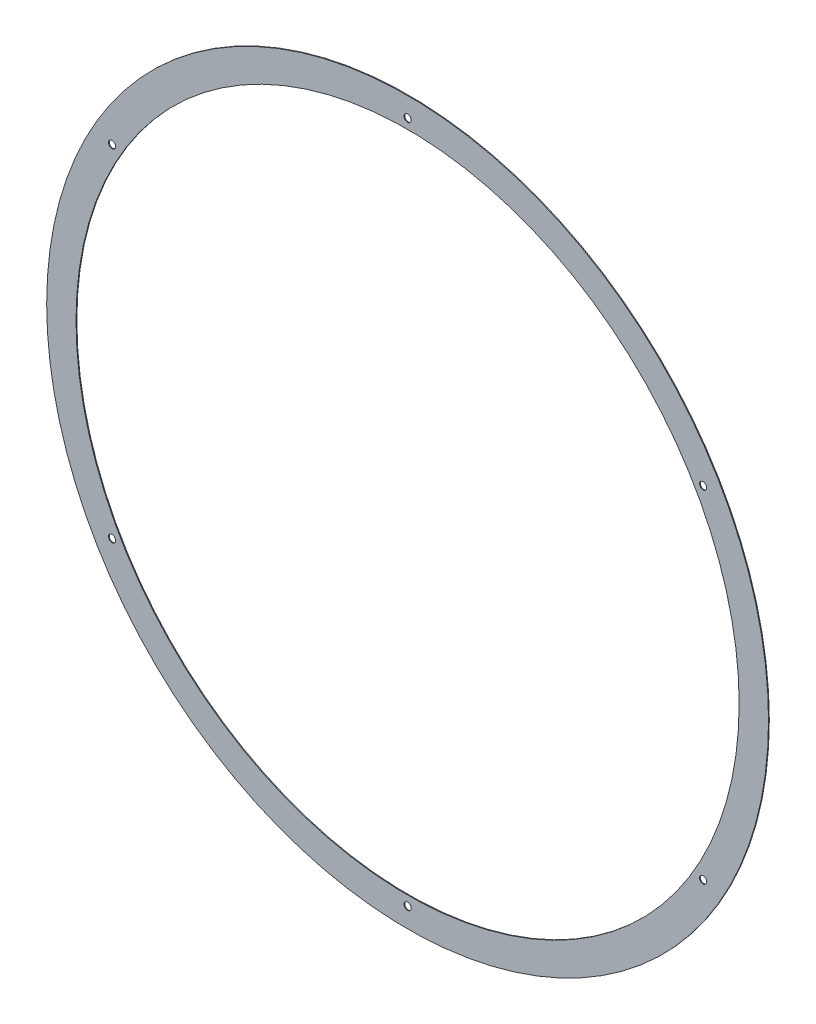
ISO-10303-21;
HEADER;
FILE_DESCRIPTION(('STEP AP214'),'2;1');
FILE_NAME('part.step','',(''),(''),'','','');
FILE_SCHEMA(('AUTOMOTIVE_DESIGN { 1 0 10303 214 1 1 1 1 }'));
ENDSEC;
DATA;
#1=APPLICATION_CONTEXT('core data for automotive mechanical design processes');
#2=APPLICATION_PROTOCOL_DEFINITION('international standard','automotive_design',2000,#1);
#3=PRODUCT_CONTEXT('',#1,'mechanical');
#4=PRODUCT('Part','Part','',(#3));
#5=PRODUCT_RELATED_PRODUCT_CATEGORY('part','',(#4));
#6=PRODUCT_DEFINITION_FORMATION('','',#4);
#7=PRODUCT_DEFINITION_CONTEXT('part definition',#1,'design');
#8=PRODUCT_DEFINITION('design','',#6,#7);
#9=PRODUCT_DEFINITION_SHAPE('','',#8);
#10=(LENGTH_UNIT() NAMED_UNIT(*) SI_UNIT(.MILLI.,.METRE.));
#11=(NAMED_UNIT(*) PLANE_ANGLE_UNIT() SI_UNIT($,.RADIAN.));
#12=(NAMED_UNIT(*) SI_UNIT($,.STERADIAN.) SOLID_ANGLE_UNIT());
#13=UNCERTAINTY_MEASURE_WITH_UNIT(LENGTH_MEASURE(1.E-05),#10,'distance_accuracy_value','');
#14=(GEOMETRIC_REPRESENTATION_CONTEXT(3) GLOBAL_UNCERTAINTY_ASSIGNED_CONTEXT((#13)) GLOBAL_UNIT_ASSIGNED_CONTEXT((#10,
#11,#12)) REPRESENTATION_CONTEXT('',''));
#15=CARTESIAN_POINT('',(0.,0.,0.));
#16=DIRECTION('',(0.,0.,1.));
#17=DIRECTION('',(1.,0.,0.));
#18=AXIS2_PLACEMENT_3D('',#15,#16,#17);
#19=CARTESIAN_POINT('',(-113.658579373613,45.928101341332,0.254));
#20=DIRECTION('',(0.,0.,-1.));
#21=DIRECTION('',(-1.,0.,0.));
#22=AXIS2_PLACEMENT_3D('',#19,#20,#21);
#23=CYLINDRICAL_SURFACE('',#22,1.1303);
#24=CARTESIAN_POINT('',(-113.658579373613,45.928101341332,0.254));
#25=DIRECTION('',(0.,0.,1.));
#26=DIRECTION('',(1.,0.,0.));
#27=AXIS2_PLACEMENT_3D('',#24,#25,#26);
#28=CIRCLE('',#27,1.1303);
#29=CARTESIAN_POINT('',(-112.528279373613,45.928101341332,0.254));
#30=VERTEX_POINT('',#29);
#31=EDGE_CURVE('E40',#30,#30,#28,.T.);
#32=ORIENTED_EDGE('',*,*,#31,.T.);
#33=EDGE_LOOP('',(#32));
#34=FACE_BOUND('',#33,.T.);
#35=CARTESIAN_POINT('',(-113.658579373613,45.928101341332,0.));
#36=DIRECTION('',(0.,0.,1.));
#37=DIRECTION('',(1.,0.,0.));
#38=AXIS2_PLACEMENT_3D('',#35,#36,#37);
#39=CIRCLE('',#38,1.1303);
#40=CARTESIAN_POINT('',(-112.528279373613,45.928101341332,0.));
#41=VERTEX_POINT('',#40);
#42=EDGE_CURVE('E66',#41,#41,#39,.T.);
#43=ORIENTED_EDGE('',*,*,#42,.F.);
#44=EDGE_LOOP('',(#43));
#45=FACE_BOUND('',#44,.T.);
#46=ADVANCED_FACE('F32',(#34,#45),#23,.F.);
#47=CARTESIAN_POINT('',(-20.0737091771575,-8.10314865866907,0.254));
#48=DIRECTION('',(0.,0.,-1.));
#49=DIRECTION('',(-1.,0.,0.));
#50=AXIS2_PLACEMENT_3D('',#47,#48,#49);
#51=CYLINDRICAL_SURFACE('',#50,105.);
#52=CARTESIAN_POINT('',(-20.0737091771575,-8.10314865866907,0.254));
#53=DIRECTION('',(0.,0.,1.));
#54=DIRECTION('',(1.,0.,0.));
#55=AXIS2_PLACEMENT_3D('',#52,#53,#54);
#56=CIRCLE('',#55,105.);
#57=CARTESIAN_POINT('',(84.9262908228426,-8.10314865866907,0.254));
#58=VERTEX_POINT('',#57);
#59=EDGE_CURVE('E45',#58,#58,#56,.T.);
#60=ORIENTED_EDGE('',*,*,#59,.T.);
#61=EDGE_LOOP('',(#60));
#62=FACE_BOUND('',#61,.T.);
#63=CARTESIAN_POINT('',(-20.0737091771575,-8.10314865866907,0.));
#64=DIRECTION('',(0.,0.,1.));
#65=DIRECTION('',(1.,0.,0.));
#66=AXIS2_PLACEMENT_3D('',#63,#64,#65);
#67=CIRCLE('',#66,105.);
#68=CARTESIAN_POINT('',(84.9262908228426,-8.10314865866907,0.));
#69=VERTEX_POINT('',#68);
#70=EDGE_CURVE('E64',#69,#69,#67,.T.);
#71=ORIENTED_EDGE('',*,*,#70,.F.);
#72=EDGE_LOOP('',(#71));
#73=FACE_BOUND('',#72,.T.);
#74=ADVANCED_FACE('F93',(#62,#73),#51,.F.);
#75=CARTESIAN_POINT('',(-20.0737091771575,99.9593513413309,0.254));
#76=DIRECTION('',(0.,0.,-1.));
#77=DIRECTION('',(-1.,0.,0.));
#78=AXIS2_PLACEMENT_3D('',#75,#76,#77);
#79=CYLINDRICAL_SURFACE('',#78,1.1303);
#80=CARTESIAN_POINT('',(-20.0737091771575,99.9593513413309,0.254));
#81=DIRECTION('',(0.,0.,1.));
#82=DIRECTION('',(1.,0.,0.));
#83=AXIS2_PLACEMENT_3D('',#80,#81,#82);
#84=CIRCLE('',#83,1.1303);
#85=CARTESIAN_POINT('',(-18.9434091771574,99.9593513413309,0.254));
#86=VERTEX_POINT('',#85);
#87=EDGE_CURVE('E88',#86,#86,#84,.T.);
#88=ORIENTED_EDGE('',*,*,#87,.T.);
#89=EDGE_LOOP('',(#88));
#90=FACE_BOUND('',#89,.T.);
#91=CARTESIAN_POINT('',(-20.0737091771575,99.9593513413309,0.));
#92=DIRECTION('',(0.,0.,1.));
#93=DIRECTION('',(1.,0.,0.));
#94=AXIS2_PLACEMENT_3D('',#91,#92,#93);
#95=CIRCLE('',#94,1.1303);
#96=CARTESIAN_POINT('',(-18.9434091771574,99.9593513413309,0.));
#97=VERTEX_POINT('',#96);
#98=EDGE_CURVE('E61',#97,#97,#95,.T.);
#99=ORIENTED_EDGE('',*,*,#98,.F.);
#100=EDGE_LOOP('',(#99));
#101=FACE_BOUND('',#100,.T.);
#102=ADVANCED_FACE('F111',(#90,#101),#79,.F.);
#103=CARTESIAN_POINT('',(73.5111610192986,45.9281013413307,0.254));
#104=DIRECTION('',(0.,0.,-1.));
#105=DIRECTION('',(-1.,0.,0.));
#106=AXIS2_PLACEMENT_3D('',#103,#104,#105);
#107=CYLINDRICAL_SURFACE('',#106,1.1303);
#108=CARTESIAN_POINT('',(73.5111610192986,45.9281013413307,0.254));
#109=DIRECTION('',(0.,0.,1.));
#110=DIRECTION('',(1.,0.,0.));
#111=AXIS2_PLACEMENT_3D('',#108,#109,#110);
#112=CIRCLE('',#111,1.1303);
#113=CARTESIAN_POINT('',(74.6414610192986,45.9281013413307,0.254));
#114=VERTEX_POINT('',#113);
#115=EDGE_CURVE('E85',#114,#114,#112,.T.);
#116=ORIENTED_EDGE('',*,*,#115,.T.);
#117=EDGE_LOOP('',(#116));
#118=FACE_BOUND('',#117,.T.);
#119=CARTESIAN_POINT('',(73.5111610192986,45.9281013413307,0.));
#120=DIRECTION('',(0.,0.,1.));
#121=DIRECTION('',(1.,0.,0.));
#122=AXIS2_PLACEMENT_3D('',#119,#120,#121);
#123=CIRCLE('',#122,1.1303);
#124=CARTESIAN_POINT('',(74.6414610192986,45.9281013413307,0.));
#125=VERTEX_POINT('',#124);
#126=EDGE_CURVE('E58',#125,#125,#123,.T.);
#127=ORIENTED_EDGE('',*,*,#126,.F.);
#128=EDGE_LOOP('',(#127));
#129=FACE_BOUND('',#128,.T.);
#130=ADVANCED_FACE('F118',(#118,#129),#107,.F.);
#131=CARTESIAN_POINT('',(73.5111610192982,-62.1343986586695,0.254));
#132=DIRECTION('',(0.,0.,-1.));
#133=DIRECTION('',(-1.,0.,0.));
#134=AXIS2_PLACEMENT_3D('',#131,#132,#133);
#135=CYLINDRICAL_SURFACE('',#134,1.1303);
#136=CARTESIAN_POINT('',(73.5111610192982,-62.1343986586695,0.254));
#137=DIRECTION('',(0.,0.,1.));
#138=DIRECTION('',(1.,0.,0.));
#139=AXIS2_PLACEMENT_3D('',#136,#137,#138);
#140=CIRCLE('',#139,1.1303);
#141=CARTESIAN_POINT('',(74.6414610192982,-62.1343986586695,0.254));
#142=VERTEX_POINT('',#141);
#143=EDGE_CURVE('E80',#142,#142,#140,.T.);
#144=ORIENTED_EDGE('',*,*,#143,.T.);
#145=EDGE_LOOP('',(#144));
#146=FACE_BOUND('',#145,.T.);
#147=CARTESIAN_POINT('',(73.5111610192982,-62.1343986586695,0.));
#148=DIRECTION('',(0.,0.,1.));
#149=DIRECTION('',(1.,0.,0.));
#150=AXIS2_PLACEMENT_3D('',#147,#148,#149);
#151=CIRCLE('',#150,1.1303);
#152=CARTESIAN_POINT('',(74.6414610192982,-62.1343986586695,0.));
#153=VERTEX_POINT('',#152);
#154=EDGE_CURVE('E55',#153,#153,#151,.T.);
#155=ORIENTED_EDGE('',*,*,#154,.F.);
#156=EDGE_LOOP('',(#155));
#157=FACE_BOUND('',#156,.T.);
#158=ADVANCED_FACE('F122',(#146,#157),#135,.F.);
#159=CARTESIAN_POINT('',(-20.0737091771582,-116.165648658669,0.254));
#160=DIRECTION('',(0.,0.,-1.));
#161=DIRECTION('',(-1.,0.,0.));
#162=AXIS2_PLACEMENT_3D('',#159,#160,#161);
#163=CYLINDRICAL_SURFACE('',#162,1.1303);
#164=CARTESIAN_POINT('',(-20.0737091771582,-116.165648658669,0.254));
#165=DIRECTION('',(0.,0.,1.));
#166=DIRECTION('',(1.,0.,0.));
#167=AXIS2_PLACEMENT_3D('',#164,#165,#166);
#168=CIRCLE('',#167,1.1303);
#169=CARTESIAN_POINT('',(-18.9434091771582,-116.165648658669,0.254));
#170=VERTEX_POINT('',#169);
#171=EDGE_CURVE('E75',#170,#170,#168,.T.);
#172=ORIENTED_EDGE('',*,*,#171,.T.);
#173=EDGE_LOOP('',(#172));
#174=FACE_BOUND('',#173,.T.);
#175=CARTESIAN_POINT('',(-20.0737091771582,-116.165648658669,0.));
#176=DIRECTION('',(0.,0.,1.));
#177=DIRECTION('',(1.,0.,0.));
#178=AXIS2_PLACEMENT_3D('',#175,#176,#177);
#179=CIRCLE('',#178,1.1303);
#180=CARTESIAN_POINT('',(-18.9434091771582,-116.165648658669,0.));
#181=VERTEX_POINT('',#180);
#182=EDGE_CURVE('E52',#181,#181,#179,.T.);
#183=ORIENTED_EDGE('',*,*,#182,.F.);
#184=EDGE_LOOP('',(#183));
#185=FACE_BOUND('',#184,.T.);
#186=ADVANCED_FACE('F125',(#174,#185),#163,.F.);
#187=CARTESIAN_POINT('',(-113.658579373614,-62.1343986586682,0.254));
#188=DIRECTION('',(0.,0.,-1.));
#189=DIRECTION('',(-1.,0.,0.));
#190=AXIS2_PLACEMENT_3D('',#187,#188,#189);
#191=CYLINDRICAL_SURFACE('',#190,1.1303);
#192=CARTESIAN_POINT('',(-113.658579373614,-62.1343986586682,0.254));
#193=DIRECTION('',(0.,0.,1.));
#194=DIRECTION('',(1.,0.,0.));
#195=AXIS2_PLACEMENT_3D('',#192,#193,#194);
#196=CIRCLE('',#195,1.1303);
#197=CARTESIAN_POINT('',(-112.528279373614,-62.1343986586682,0.254));
#198=VERTEX_POINT('',#197);
#199=EDGE_CURVE('E71',#198,#198,#196,.T.);
#200=ORIENTED_EDGE('',*,*,#199,.T.);
#201=EDGE_LOOP('',(#200));
#202=FACE_BOUND('',#201,.T.);
#203=CARTESIAN_POINT('',(-113.658579373614,-62.1343986586682,0.));
#204=DIRECTION('',(0.,0.,1.));
#205=DIRECTION('',(1.,0.,0.));
#206=AXIS2_PLACEMENT_3D('',#203,#204,#205);
#207=CIRCLE('',#206,1.1303);
#208=CARTESIAN_POINT('',(-112.528279373614,-62.1343986586682,0.));
#209=VERTEX_POINT('',#208);
#210=EDGE_CURVE('E49',#209,#209,#207,.T.);
#211=ORIENTED_EDGE('',*,*,#210,.F.);
#212=EDGE_LOOP('',(#211));
#213=FACE_BOUND('',#212,.T.);
#214=ADVANCED_FACE('F34',(#202,#213),#191,.F.);
#215=CARTESIAN_POINT('',(-20.0737091771575,-8.10314865866907,0.254));
#216=DIRECTION('',(0.,0.,-1.));
#217=DIRECTION('',(-1.,0.,0.));
#218=AXIS2_PLACEMENT_3D('',#215,#216,#217);
#219=CYLINDRICAL_SURFACE('',#218,114.3);
#220=CARTESIAN_POINT('',(-20.0737091771575,-8.10314865866907,0.254));
#221=DIRECTION('',(0.,0.,1.));
#222=DIRECTION('',(1.,0.,0.));
#223=AXIS2_PLACEMENT_3D('',#220,#221,#222);
#224=CIRCLE('',#223,114.3);
#225=CARTESIAN_POINT('',(94.2262908228426,-8.10314865866907,0.254));
#226=VERTEX_POINT('',#225);
#227=EDGE_CURVE('E10',#226,#226,#224,.T.);
#228=ORIENTED_EDGE('',*,*,#227,.F.);
#229=EDGE_LOOP('',(#228));
#230=FACE_BOUND('',#229,.T.);
#231=CARTESIAN_POINT('',(-20.0737091771575,-8.10314865866907,0.));
#232=DIRECTION('',(0.,0.,1.));
#233=DIRECTION('',(1.,0.,0.));
#234=AXIS2_PLACEMENT_3D('',#231,#232,#233);
#235=CIRCLE('',#234,114.3);
#236=CARTESIAN_POINT('',(94.2262908228426,-8.10314865866907,0.));
#237=VERTEX_POINT('',#236);
#238=EDGE_CURVE('E36',#237,#237,#235,.T.);
#239=ORIENTED_EDGE('',*,*,#238,.T.);
#240=EDGE_LOOP('',(#239));
#241=FACE_BOUND('',#240,.T.);
#242=ADVANCED_FACE('F100',(#230,#241),#219,.T.);
#243=CARTESIAN_POINT('',(-20.0737091771574,-259.704570014906,0.254));
#244=DIRECTION('',(0.,0.,1.));
#245=DIRECTION('',(1.,0.,0.));
#246=AXIS2_PLACEMENT_3D('',#243,#244,#245);
#247=PLANE('',#246);
#248=ORIENTED_EDGE('',*,*,#199,.F.);
#249=EDGE_LOOP('',(#248));
#250=FACE_BOUND('',#249,.T.);
#251=ORIENTED_EDGE('',*,*,#171,.F.);
#252=EDGE_LOOP('',(#251));
#253=FACE_BOUND('',#252,.T.);
#254=ORIENTED_EDGE('',*,*,#143,.F.);
#255=EDGE_LOOP('',(#254));
#256=FACE_BOUND('',#255,.T.);
#257=ORIENTED_EDGE('',*,*,#115,.F.);
#258=EDGE_LOOP('',(#257));
#259=FACE_BOUND('',#258,.T.);
#260=ORIENTED_EDGE('',*,*,#87,.F.);
#261=EDGE_LOOP('',(#260));
#262=FACE_BOUND('',#261,.T.);
#263=ORIENTED_EDGE('',*,*,#59,.F.);
#264=EDGE_LOOP('',(#263));
#265=FACE_BOUND('',#264,.T.);
#266=ORIENTED_EDGE('',*,*,#31,.F.);
#267=EDGE_LOOP('',(#266));
#268=FACE_BOUND('',#267,.T.);
#269=ORIENTED_EDGE('',*,*,#227,.T.);
#270=EDGE_LOOP('',(#269));
#271=FACE_BOUND('',#270,.T.);
#272=ADVANCED_FACE('F96',(#250,#253,#256,#259,#262,#265,#268,#271),#247,.T.);
#273=CARTESIAN_POINT('',(-20.0737091771574,-259.704570014906,0.));
#274=DIRECTION('',(0.,0.,1.));
#275=DIRECTION('',(1.,0.,0.));
#276=AXIS2_PLACEMENT_3D('',#273,#274,#275);
#277=PLANE('',#276);
#278=ORIENTED_EDGE('',*,*,#210,.T.);
#279=EDGE_LOOP('',(#278));
#280=FACE_BOUND('',#279,.T.);
#281=ORIENTED_EDGE('',*,*,#182,.T.);
#282=EDGE_LOOP('',(#281));
#283=FACE_BOUND('',#282,.T.);
#284=ORIENTED_EDGE('',*,*,#154,.T.);
#285=EDGE_LOOP('',(#284));
#286=FACE_BOUND('',#285,.T.);
#287=ORIENTED_EDGE('',*,*,#126,.T.);
#288=EDGE_LOOP('',(#287));
#289=FACE_BOUND('',#288,.T.);
#290=ORIENTED_EDGE('',*,*,#98,.T.);
#291=EDGE_LOOP('',(#290));
#292=FACE_BOUND('',#291,.T.);
#293=ORIENTED_EDGE('',*,*,#70,.T.);
#294=EDGE_LOOP('',(#293));
#295=FACE_BOUND('',#294,.T.);
#296=ORIENTED_EDGE('',*,*,#42,.T.);
#297=EDGE_LOOP('',(#296));
#298=FACE_BOUND('',#297,.T.);
#299=ORIENTED_EDGE('',*,*,#238,.F.);
#300=EDGE_LOOP('',(#299));
#301=FACE_BOUND('',#300,.T.);
#302=ADVANCED_FACE('F99',(#280,#283,#286,#289,#292,#295,#298,#301),#277,.F.);
#303=CLOSED_SHELL('',(#46,#74,#102,#130,#158,#186,#214,#242,#272,#302));
#304=MANIFOLD_SOLID_BREP('B2',#303);
#305=ADVANCED_BREP_SHAPE_REPRESENTATION('',(#18,#304),#14);
#306=SHAPE_DEFINITION_REPRESENTATION(#9,#305);
ENDSEC;
END-ISO-10303-21;
